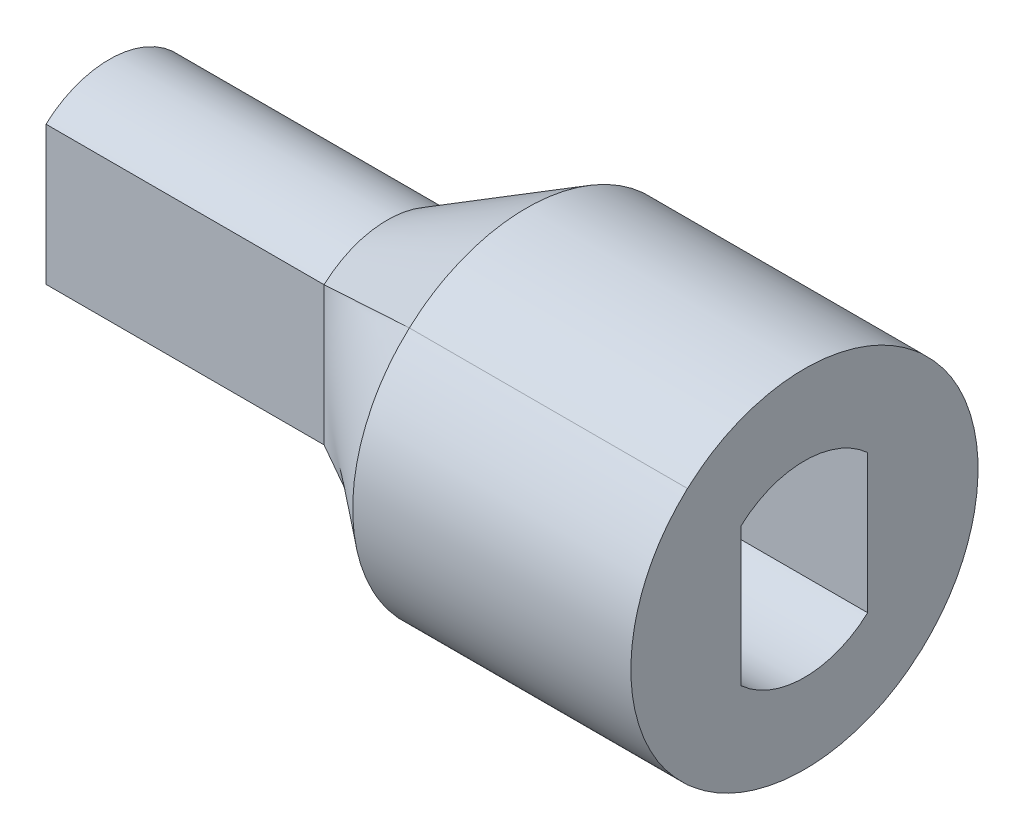
ISO-10303-21;
HEADER;
FILE_DESCRIPTION(('STEP AP214'),'2;1');
FILE_NAME('part.step','',(''),(''),'','','');
FILE_SCHEMA(('AUTOMOTIVE_DESIGN { 1 0 10303 214 1 1 1 1 }'));
ENDSEC;
DATA;
#1=APPLICATION_CONTEXT('core data for automotive mechanical design processes');
#2=APPLICATION_PROTOCOL_DEFINITION('international standard','automotive_design',2000,#1);
#3=PRODUCT_CONTEXT('',#1,'mechanical');
#4=PRODUCT('Part','Part','',(#3));
#5=PRODUCT_RELATED_PRODUCT_CATEGORY('part','',(#4));
#6=PRODUCT_DEFINITION_FORMATION('','',#4);
#7=PRODUCT_DEFINITION_CONTEXT('part definition',#1,'design');
#8=PRODUCT_DEFINITION('design','',#6,#7);
#9=PRODUCT_DEFINITION_SHAPE('','',#8);
#10=(LENGTH_UNIT() NAMED_UNIT(*) SI_UNIT(.MILLI.,.METRE.));
#11=(NAMED_UNIT(*) PLANE_ANGLE_UNIT() SI_UNIT($,.RADIAN.));
#12=(NAMED_UNIT(*) SI_UNIT($,.STERADIAN.) SOLID_ANGLE_UNIT());
#13=UNCERTAINTY_MEASURE_WITH_UNIT(LENGTH_MEASURE(1.E-05),#10,'distance_accuracy_value','');
#14=(GEOMETRIC_REPRESENTATION_CONTEXT(3) GLOBAL_UNCERTAINTY_ASSIGNED_CONTEXT((#13)) GLOBAL_UNIT_ASSIGNED_CONTEXT((#10,
#11,#12)) REPRESENTATION_CONTEXT('',''));
#15=CARTESIAN_POINT('',(0.,0.,0.));
#16=DIRECTION('',(0.,0.,1.));
#17=DIRECTION('',(1.,0.,0.));
#18=AXIS2_PLACEMENT_3D('',#15,#16,#17);
#19=CARTESIAN_POINT('',(8.,0.,-1.81870614886455));
#20=DIRECTION('',(0.,0.,1.));
#21=DIRECTION('',(1.,0.,0.));
#22=AXIS2_PLACEMENT_3D('',#19,#20,#21);
#23=PLANE('',#22);
#24=DIRECTION('',(0.,1.,0.));
#25=VECTOR('',#24,1.);
#26=CARTESIAN_POINT('',(0.,0.,-1.81870614886455));
#27=LINE('',#26,#25);
#28=CARTESIAN_POINT('',(0.,-1.99557208441145,-1.81870614886455));
#29=VERTEX_POINT('',#28);
#30=CARTESIAN_POINT('',(0.,1.99557208441145,-1.81870614886455));
#31=VERTEX_POINT('',#30);
#32=EDGE_CURVE('E446',#29,#31,#27,.T.);
#33=ORIENTED_EDGE('',*,*,#32,.T.);
#34=DIRECTION('',(-1.,0.,0.));
#35=VECTOR('',#34,1.);
#36=CARTESIAN_POINT('',(8.,1.99557208441145,-1.81870614886455));
#37=LINE('',#36,#35);
#38=CARTESIAN_POINT('',(8.,1.99557208441145,-1.81870614886455));
#39=VERTEX_POINT('',#38);
#40=EDGE_CURVE('E12',#39,#31,#37,.T.);
#41=ORIENTED_EDGE('',*,*,#40,.F.);
#42=DIRECTION('',(0.,1.,0.));
#43=VECTOR('',#42,1.);
#44=CARTESIAN_POINT('',(8.,0.,-1.81870614886455));
#45=LINE('',#44,#43);
#46=CARTESIAN_POINT('',(8.,-1.99557208441145,-1.81870614886455));
#47=VERTEX_POINT('',#46);
#48=EDGE_CURVE('E483',#47,#39,#45,.T.);
#49=ORIENTED_EDGE('',*,*,#48,.F.);
#50=DIRECTION('',(-1.,0.,0.));
#51=VECTOR('',#50,1.);
#52=CARTESIAN_POINT('',(8.,-1.99557208441145,-1.81870614886455));
#53=LINE('',#52,#51);
#54=EDGE_CURVE('E449',#47,#29,#53,.T.);
#55=ORIENTED_EDGE('',*,*,#54,.T.);
#56=EDGE_LOOP('',(#33,#41,#49,#55));
#57=FACE_BOUND('',#56,.T.);
#58=ADVANCED_FACE('F71',(#57),#23,.F.);
#59=CARTESIAN_POINT('',(8.,0.,0.));
#60=DIRECTION('',(-1.,0.,0.));
#61=DIRECTION('',(0.,0.,1.));
#62=AXIS2_PLACEMENT_3D('',#59,#60,#61);
#63=CYLINDRICAL_SURFACE('',#62,2.7);
#64=CARTESIAN_POINT('',(0.,0.,0.));
#65=DIRECTION('',(1.,0.,0.));
#66=DIRECTION('',(0.,0.,-1.));
#67=AXIS2_PLACEMENT_3D('',#64,#65,#66);
#68=CIRCLE('',#67,2.7);
#69=CARTESIAN_POINT('',(0.,1.99557208441145,1.81870614886455));
#70=VERTEX_POINT('',#69);
#71=EDGE_CURVE('E453',#31,#70,#68,.T.);
#72=ORIENTED_EDGE('',*,*,#71,.T.);
#73=DIRECTION('',(-1.,0.,0.));
#74=VECTOR('',#73,1.);
#75=CARTESIAN_POINT('',(8.,1.99557208441145,1.81870614886455));
#76=LINE('',#75,#74);
#77=CARTESIAN_POINT('',(8.,1.99557208441145,1.81870614886455));
#78=VERTEX_POINT('',#77);
#79=EDGE_CURVE('E81',#78,#70,#76,.T.);
#80=ORIENTED_EDGE('',*,*,#79,.F.);
#81=CARTESIAN_POINT('',(8.,0.,0.));
#82=DIRECTION('',(1.,0.,0.));
#83=DIRECTION('',(0.,0.,-1.));
#84=AXIS2_PLACEMENT_3D('',#81,#82,#83);
#85=CIRCLE('',#84,2.7);
#86=EDGE_CURVE('E486',#39,#78,#85,.T.);
#87=ORIENTED_EDGE('',*,*,#86,.F.);
#88=ORIENTED_EDGE('',*,*,#40,.T.);
#89=EDGE_LOOP('',(#72,#80,#87,#88));
#90=FACE_BOUND('',#89,.T.);
#91=ADVANCED_FACE('F432',(#90),#63,.T.);
#92=CARTESIAN_POINT('',(8.,0.,1.81870614886455));
#93=DIRECTION('',(0.,0.,1.));
#94=DIRECTION('',(1.,0.,0.));
#95=AXIS2_PLACEMENT_3D('',#92,#93,#94);
#96=PLANE('',#95);
#97=DIRECTION('',(0.,1.,0.));
#98=VECTOR('',#97,1.);
#99=CARTESIAN_POINT('',(0.,0.,1.81870614886455));
#100=LINE('',#99,#98);
#101=CARTESIAN_POINT('',(0.,-1.99557208441145,1.81870614886455));
#102=VERTEX_POINT('',#101);
#103=EDGE_CURVE('E459',#102,#70,#100,.T.);
#104=ORIENTED_EDGE('',*,*,#103,.F.);
#105=DIRECTION('',(-1.,0.,0.));
#106=VECTOR('',#105,1.);
#107=CARTESIAN_POINT('',(8.,-1.99557208441145,1.81870614886455));
#108=LINE('',#107,#106);
#109=CARTESIAN_POINT('',(8.,-1.99557208441145,1.81870614886455));
#110=VERTEX_POINT('',#109);
#111=EDGE_CURVE('E474',#110,#102,#108,.T.);
#112=ORIENTED_EDGE('',*,*,#111,.F.);
#113=DIRECTION('',(0.,1.,0.));
#114=VECTOR('',#113,1.);
#115=CARTESIAN_POINT('',(8.,0.,1.81870614886455));
#116=LINE('',#115,#114);
#117=EDGE_CURVE('E482',#110,#78,#116,.T.);
#118=ORIENTED_EDGE('',*,*,#117,.T.);
#119=ORIENTED_EDGE('',*,*,#79,.T.);
#120=EDGE_LOOP('',(#104,#112,#118,#119));
#121=FACE_BOUND('',#120,.T.);
#122=ADVANCED_FACE('F438',(#121),#96,.T.);
#123=EDGE_CURVE('E461',#102,#29,#68,.T.);
#124=ORIENTED_EDGE('',*,*,#123,.T.);
#125=ORIENTED_EDGE('',*,*,#54,.F.);
#126=CARTESIAN_POINT('',(8.,0.,0.));
#127=DIRECTION('',(1.,0.,0.));
#128=DIRECTION('',(0.,0.,-1.));
#129=AXIS2_PLACEMENT_3D('',#126,#127,#128);
#130=CIRCLE('',#129,2.7);
#131=EDGE_CURVE('E478',#110,#47,#130,.T.);
#132=ORIENTED_EDGE('',*,*,#131,.F.);
#133=ORIENTED_EDGE('',*,*,#111,.T.);
#134=EDGE_LOOP('',(#124,#125,#132,#133));
#135=FACE_BOUND('',#134,.T.);
#136=ADVANCED_FACE('F441',(#135),#63,.T.);
#137=CARTESIAN_POINT('',(0.,0.,0.));
#138=DIRECTION('',(1.,0.,0.));
#139=DIRECTION('',(0.,0.,-1.));
#140=AXIS2_PLACEMENT_3D('',#137,#138,#139);
#141=PLANE('',#140);
#142=ORIENTED_EDGE('',*,*,#32,.F.);
#143=ORIENTED_EDGE('',*,*,#123,.F.);
#144=ORIENTED_EDGE('',*,*,#103,.T.);
#145=ORIENTED_EDGE('',*,*,#71,.F.);
#146=EDGE_LOOP('',(#142,#143,#144,#145));
#147=FACE_BOUND('',#146,.T.);
#148=ADVANCED_FACE('F529',(#147),#141,.F.);
#149=CARTESIAN_POINT('',(8.,0.,0.));
#150=DIRECTION('',(1.,0.,0.));
#151=DIRECTION('',(0.,0.,-1.));
#152=AXIS2_PLACEMENT_3D('',#149,#150,#151);
#153=CONICAL_SURFACE('',#152,2.7,0.521176118415313);
#154=DIRECTION('',(0.86723418972472,0.367998608506939,0.33538319026073));
#155=VECTOR('',#154,1.);
#156=CARTESIAN_POINT('',(8.,1.99557208441145,1.81870614886455));
#157=LINE('',#156,#155);
#158=CARTESIAN_POINT('',(12.,3.69291572176851,3.36561559609098));
#159=VERTEX_POINT('',#158);
#160=EDGE_CURVE('E97',#78,#159,#157,.T.);
#161=ORIENTED_EDGE('',*,*,#160,.T.);
#162=CARTESIAN_POINT('',(12.,0.,0.));
#163=DIRECTION('',(1.,0.,0.));
#164=DIRECTION('',(0.,0.,-1.));
#165=AXIS2_PLACEMENT_3D('',#162,#163,#164);
#166=CIRCLE('',#165,4.99649826065574);
#167=CARTESIAN_POINT('',(12.,3.69291572176851,-3.36561559609098));
#168=VERTEX_POINT('',#167);
#169=EDGE_CURVE('E261',#168,#159,#166,.T.);
#170=ORIENTED_EDGE('',*,*,#169,.F.);
#171=DIRECTION('',(0.86723418972472,0.367998608506939,-0.33538319026073));
#172=VECTOR('',#171,1.);
#173=CARTESIAN_POINT('',(8.,1.99557208441145,-1.81870614886455));
#174=LINE('',#173,#172);
#175=EDGE_CURVE('E276',#39,#168,#174,.T.);
#176=ORIENTED_EDGE('',*,*,#175,.F.);
#177=ORIENTED_EDGE('',*,*,#86,.T.);
#178=EDGE_LOOP('',(#161,#170,#176,#177));
#179=FACE_BOUND('',#178,.T.);
#180=ADVANCED_FACE('F236',(#179),#153,.T.);
#181=CARTESIAN_POINT('',(8.,-1.99557208441145,-1.81870614886455));
#182=CARTESIAN_POINT('',(12.,-3.69291572176851,-3.36561559609098));
#183=CARTESIAN_POINT('',(8.,-1.8292744107105,-1.81870614886455));
#184=CARTESIAN_POINT('',(12.,-3.48562163132348,-3.59306866783312));
#185=CARTESIAN_POINT('',(8.,-1.66297673700954,-1.81870614886455));
#186=CARTESIAN_POINT('',(12.,-3.24853151808313,-3.81075682692467));
#187=CARTESIAN_POINT('',(8.,-1.33038138960764,-1.81870614886455));
#188=CARTESIAN_POINT('',(12.,-2.71677138618844,-4.2064210266116));
#189=CARTESIAN_POINT('',(8.,-1.16408371590668,-1.81870614886455));
#190=CARTESIAN_POINT('',(12.,-2.42204965704319,-4.38424865942471));
#191=CARTESIAN_POINT('',(8.,-0.831488368504773,-1.81870614886455));
#192=CARTESIAN_POINT('',(12.,-1.7859309912595,-4.67957384206182));
#193=CARTESIAN_POINT('',(8.,-0.665190694803818,-1.81870614886455));
#194=CARTESIAN_POINT('',(12.,-1.44458471323877,-4.79689289330503));
#195=CARTESIAN_POINT('',(8.,-0.33259534740191,-1.81870614886455));
#196=CARTESIAN_POINT('',(12.,-0.735418950472063,-4.95541778166584));
#197=CARTESIAN_POINT('',(8.,-0.166297673700956,-1.81870614886455));
#198=CARTESIAN_POINT('',(12.,-0.367762810868639,-4.99649826065574));
#199=CARTESIAN_POINT('',(8.,0.166297673700953,-1.81870614886455));
#200=CARTESIAN_POINT('',(12.,0.367762810868638,-4.99649826065574));
#201=CARTESIAN_POINT('',(8.,0.332595347401908,-1.81870614886455));
#202=CARTESIAN_POINT('',(12.,0.735418950472063,-4.95541778166584));
#203=CARTESIAN_POINT('',(8.,0.665190694803817,-1.81870614886455));
#204=CARTESIAN_POINT('',(12.,1.44458471323877,-4.79689289330503));
#205=CARTESIAN_POINT('',(8.,0.831488368504771,-1.81870614886455));
#206=CARTESIAN_POINT('',(12.,1.7859309912595,-4.67957384206182));
#207=CARTESIAN_POINT('',(8.,1.16408371590668,-1.81870614886455));
#208=CARTESIAN_POINT('',(12.,2.42204965704319,-4.38424865942471));
#209=CARTESIAN_POINT('',(8.,1.33038138960763,-1.81870614886455));
#210=CARTESIAN_POINT('',(12.,2.71677138618844,-4.20642102661161));
#211=CARTESIAN_POINT('',(8.,1.66297673700954,-1.81870614886455));
#212=CARTESIAN_POINT('',(12.,3.24853151808313,-3.81075682692468));
#213=CARTESIAN_POINT('',(8.,1.8292744107105,-1.81870614886455));
#214=CARTESIAN_POINT('',(12.,3.48562163132348,-3.59306866783312));
#215=CARTESIAN_POINT('',(8.,1.99557208441145,-1.81870614886455));
#216=CARTESIAN_POINT('',(12.,3.69291572176851,-3.36561559609098));
#217=B_SPLINE_SURFACE_WITH_KNOTS('',3,1,((#181,#182),(#183,#184),(#185,#186),(#187,#188),(#189,
#190),(#191,#192),(#193,#194),(#195,#196),(#197,#198),(#199,#200),(#201,#202),(#203,#204),(#205,
#206),(#207,#208),(#209,#210),(#211,#212),(#213,#214),(#215,#216)),.UNSPECIFIED.,.F.,.F.,.F.,(4,
2,2,2,2,2,2,2,4),(2,2),(0.,0.125,0.25,0.375,0.5,0.625,0.75,0.875,1.),(0.,1.),.UNSPECIFIED.);
#218=CARTESIAN_POINT('',(12.,-3.69291572176851,-3.36561559609097));
#219=VERTEX_POINT('',#218);
#220=EDGE_CURVE('E74',#219,#168,#166,.T.);
#221=DIRECTION('',(0.86723418972472,-0.367998608506939,-0.33538319026073));
#222=VECTOR('',#221,1.);
#223=CARTESIAN_POINT('',(8.,-1.99557208441145,-1.81870614886455));
#224=LINE('',#223,#222);
#225=EDGE_CURVE('E454',#47,#219,#224,.T.);
#226=ORIENTED_EDGE('',*,*,#48,.T.);
#227=ORIENTED_EDGE('',*,*,#175,.T.);
#228=ORIENTED_EDGE('',*,*,#220,.F.);
#229=ORIENTED_EDGE('',*,*,#225,.F.);
#230=EDGE_LOOP('',(#226,#227,#228,#229));
#231=FACE_BOUND('',#230,.T.);
#232=ADVANCED_FACE('F550',(#231),#217,.T.);
#233=CARTESIAN_POINT('',(8.,1.99557208441145,1.81870614886455));
#234=CARTESIAN_POINT('',(12.,3.69291572176851,3.36561559609098));
#235=CARTESIAN_POINT('',(8.,1.8292744107105,1.81870614886455));
#236=CARTESIAN_POINT('',(12.,3.48562163132348,3.59306866783312));
#237=CARTESIAN_POINT('',(8.,1.66297673700954,1.81870614886455));
#238=CARTESIAN_POINT('',(12.,3.24853151808313,3.81075682692468));
#239=CARTESIAN_POINT('',(8.,1.33038138960764,1.81870614886455));
#240=CARTESIAN_POINT('',(12.,2.71677138618844,4.2064210266116));
#241=CARTESIAN_POINT('',(8.,1.16408371590668,1.81870614886455));
#242=CARTESIAN_POINT('',(12.,2.42204965704319,4.38424865942471));
#243=CARTESIAN_POINT('',(8.,0.831488368504773,1.81870614886455));
#244=CARTESIAN_POINT('',(12.,1.7859309912595,4.67957384206182));
#245=CARTESIAN_POINT('',(8.,0.665190694803819,1.81870614886455));
#246=CARTESIAN_POINT('',(12.,1.44458471323877,4.79689289330503));
#247=CARTESIAN_POINT('',(8.,0.33259534740191,1.81870614886455));
#248=CARTESIAN_POINT('',(12.,0.735418950472064,4.95541778166584));
#249=CARTESIAN_POINT('',(8.,0.166297673700956,1.81870614886455));
#250=CARTESIAN_POINT('',(12.,0.367762810868639,4.99649826065574));
#251=CARTESIAN_POINT('',(8.,-0.166297673700953,1.81870614886455));
#252=CARTESIAN_POINT('',(12.,-0.367762810868637,4.99649826065574));
#253=CARTESIAN_POINT('',(8.,-0.332595347401907,1.81870614886455));
#254=CARTESIAN_POINT('',(12.,-0.735418950472062,4.95541778166584));
#255=CARTESIAN_POINT('',(8.,-0.665190694803816,1.81870614886455));
#256=CARTESIAN_POINT('',(12.,-1.44458471323877,4.79689289330503));
#257=CARTESIAN_POINT('',(8.,-0.831488368504771,1.81870614886455));
#258=CARTESIAN_POINT('',(12.,-1.7859309912595,4.67957384206182));
#259=CARTESIAN_POINT('',(8.,-1.16408371590668,1.81870614886455));
#260=CARTESIAN_POINT('',(12.,-2.42204965704319,4.38424865942471));
#261=CARTESIAN_POINT('',(8.,-1.33038138960763,1.81870614886455));
#262=CARTESIAN_POINT('',(12.,-2.71677138618844,4.20642102661161));
#263=CARTESIAN_POINT('',(8.,-1.66297673700954,1.81870614886455));
#264=CARTESIAN_POINT('',(12.,-3.24853151808313,3.81075682692468));
#265=CARTESIAN_POINT('',(8.,-1.8292744107105,1.81870614886455));
#266=CARTESIAN_POINT('',(12.,-3.48562163132348,3.59306866783312));
#267=CARTESIAN_POINT('',(8.,-1.99557208441145,1.81870614886455));
#268=CARTESIAN_POINT('',(12.,-3.69291572176851,3.36561559609098));
#269=B_SPLINE_SURFACE_WITH_KNOTS('',3,1,((#233,#234),(#235,#236),(#237,#238),(#239,#240),(#241,
#242),(#243,#244),(#245,#246),(#247,#248),(#249,#250),(#251,#252),(#253,#254),(#255,#256),(#257,
#258),(#259,#260),(#261,#262),(#263,#264),(#265,#266),(#267,#268)),.UNSPECIFIED.,.F.,.F.,.F.,(4,
2,2,2,2,2,2,2,4),(2,2),(0.,0.125,0.25,0.375,0.5,0.625,0.75,0.875,1.),(0.,1.),.UNSPECIFIED.);
#270=DIRECTION('',(0.86723418972472,-0.367998608506938,0.335383190260731));
#271=VECTOR('',#270,1.);
#272=CARTESIAN_POINT('',(10.,-2.84424390308998,2.59216087247777));
#273=LINE('',#272,#271);
#274=CARTESIAN_POINT('',(12.,-3.69291572176851,3.36561559609098));
#275=VERTEX_POINT('',#274);
#276=EDGE_CURVE('E256',#110,#275,#273,.T.);
#277=EDGE_CURVE('E264',#159,#275,#166,.T.);
#278=ORIENTED_EDGE('',*,*,#117,.F.);
#279=ORIENTED_EDGE('',*,*,#276,.T.);
#280=ORIENTED_EDGE('',*,*,#277,.F.);
#281=ORIENTED_EDGE('',*,*,#160,.F.);
#282=EDGE_LOOP('',(#278,#279,#280,#281));
#283=FACE_BOUND('',#282,.T.);
#284=ADVANCED_FACE('F497',(#283),#269,.T.);
#285=CARTESIAN_POINT('',(8.,0.,0.));
#286=DIRECTION('',(1.,0.,0.));
#287=DIRECTION('',(0.,0.,-1.));
#288=AXIS2_PLACEMENT_3D('',#285,#286,#287);
#289=CONICAL_SURFACE('',#288,2.7,0.521176118415313);
#290=ORIENTED_EDGE('',*,*,#225,.T.);
#291=EDGE_CURVE('E266',#275,#219,#166,.T.);
#292=ORIENTED_EDGE('',*,*,#291,.F.);
#293=ORIENTED_EDGE('',*,*,#276,.F.);
#294=ORIENTED_EDGE('',*,*,#131,.T.);
#295=EDGE_LOOP('',(#290,#292,#293,#294));
#296=FACE_BOUND('',#295,.T.);
#297=ADVANCED_FACE('F232',(#296),#289,.T.);
#298=CARTESIAN_POINT('',(20.,3.69291572176851,3.36561559609098));
#299=CARTESIAN_POINT('',(20.,3.5729146397091,3.49069687233272));
#300=CARTESIAN_POINT('',(20.,3.3284088282014,3.73620465926743));
#301=CARTESIAN_POINT('',(20.,2.92527797189008,4.06356608337924));
#302=CARTESIAN_POINT('',(20.,2.48841073758551,4.34450729753157));
#303=CARTESIAN_POINT('',(20.,1.86901592415575,4.65561273686763));
#304=CARTESIAN_POINT('',(20.,1.03942388692487,4.9214586641175));
#305=CARTESIAN_POINT('',(20.,0.173244932208205,5.01224150102338));
#306=CARTESIAN_POINT('',(20.,-0.519716016392923,4.97623765002099));
#307=CARTESIAN_POINT('',(20.,-1.03400007893868,4.8956556220121));
#308=CARTESIAN_POINT('',(20.,-1.62120597598052,4.74033323006369));
#309=CARTESIAN_POINT('',(20.,-2.10373134300273,4.54338367213307));
#310=CARTESIAN_POINT('',(20.,-2.56107621326455,4.29773565047842));
#311=CARTESIAN_POINT('',(20.,-2.92470388796895,4.06310134007066));
#312=CARTESIAN_POINT('',(20.,-3.32680871798416,3.73476861874533));
#313=CARTESIAN_POINT('',(20.,-3.57218692271475,3.49004450756609));
#314=CARTESIAN_POINT('',(20.,-3.69291572176851,3.36561559609098));
#315=B_SPLINE_CURVE_WITH_KNOTS('',3,(#298,#299,#300,#301,#302,#303,#304,#305,#306,#307,#308,
#309,#310,#311,#312,#313,#314),.UNSPECIFIED.,.F.,.F.,(4,1,1,1,1,1,1,1,1,1,1,1,1,1,4),(0.,0.0625,
0.125,0.1875,0.25,0.375,0.5,0.5625,0.625,0.6875,0.78125,0.8125,0.875,0.9375,1.),.UNSPECIFIED.);
#316=DIRECTION('',(-1.,0.,0.));
#317=VECTOR('',#316,1.);
#318=SURFACE_OF_LINEAR_EXTRUSION('',#315,#317);
#319=ORIENTED_EDGE('',*,*,#277,.T.);
#320=DIRECTION('',(-1.,0.,0.));
#321=VECTOR('',#320,1.);
#322=CARTESIAN_POINT('',(20.,-3.69291572176851,3.36561559609098));
#323=LINE('',#322,#321);
#324=CARTESIAN_POINT('',(20.,-3.69291572176851,3.36561559609098));
#325=VERTEX_POINT('',#324);
#326=EDGE_CURVE('E292',#325,#275,#323,.T.);
#327=ORIENTED_EDGE('',*,*,#326,.F.);
#328=CARTESIAN_POINT('',(20.,-3.69291572176851,3.36561559609098));
#329=CARTESIAN_POINT('',(20.,-3.57218692271475,3.49004450756609));
#330=CARTESIAN_POINT('',(20.,-3.32680871798416,3.73476861874533));
#331=CARTESIAN_POINT('',(20.,-2.92470388796895,4.06310134007066));
#332=CARTESIAN_POINT('',(20.,-2.56107621326455,4.29773565047842));
#333=CARTESIAN_POINT('',(20.,-2.10373134300273,4.54338367213307));
#334=CARTESIAN_POINT('',(20.,-1.62120597598052,4.74033323006369));
#335=CARTESIAN_POINT('',(20.,-1.03400007893868,4.8956556220121));
#336=CARTESIAN_POINT('',(20.,-0.519716016392923,4.97623765002099));
#337=CARTESIAN_POINT('',(20.,0.173244932208205,5.01224150102338));
#338=CARTESIAN_POINT('',(20.,1.03942388692487,4.9214586641175));
#339=CARTESIAN_POINT('',(20.,1.86901592415575,4.65561273686763));
#340=CARTESIAN_POINT('',(20.,2.48841073758551,4.34450729753157));
#341=CARTESIAN_POINT('',(20.,2.92527797189008,4.06356608337924));
#342=CARTESIAN_POINT('',(20.,3.3284088282014,3.73620465926743));
#343=CARTESIAN_POINT('',(20.,3.5729146397091,3.49069687233272));
#344=CARTESIAN_POINT('',(20.,3.69291572176851,3.36561559609098));
#345=B_SPLINE_CURVE_WITH_KNOTS('',3,(#328,#329,#330,#331,#332,#333,#334,#335,#336,#337,#338,
#339,#340,#341,#342,#343,#344),.UNSPECIFIED.,.F.,.F.,(4,1,1,1,1,1,1,1,1,1,1,1,1,1,4),(0.,0.0625,
0.125,0.1875,0.21875,0.3125,0.375,0.4375,0.5,0.625,0.75,0.8125,0.875,0.9375,1.),.UNSPECIFIED.);
#346=CARTESIAN_POINT('',(20.,3.69291572176851,3.36561559609098));
#347=VERTEX_POINT('',#346);
#348=EDGE_CURVE('E208',#347,#325,#345,.F.);
#349=ORIENTED_EDGE('',*,*,#348,.F.);
#350=DIRECTION('',(-1.,0.,0.));
#351=VECTOR('',#350,1.);
#352=CARTESIAN_POINT('',(20.,3.69291572176851,3.36561559609098));
#353=LINE('',#352,#351);
#354=EDGE_CURVE('E368',#347,#159,#353,.T.);
#355=ORIENTED_EDGE('',*,*,#354,.T.);
#356=EDGE_LOOP('',(#319,#327,#349,#355));
#357=FACE_BOUND('',#356,.T.);
#358=ADVANCED_FACE('F226',(#357),#318,.F.);
#359=CARTESIAN_POINT('',(20.,-3.69291572176851,3.36561559609098));
#360=CARTESIAN_POINT('',(20.,-3.74261446355927,3.30678744791323));
#361=CARTESIAN_POINT('',(20.,-3.84152511231977,3.18876956217872));
#362=CARTESIAN_POINT('',(20.,-3.98552462795836,3.00849967661833));
#363=CARTESIAN_POINT('',(20.,-4.12129666230725,2.82219052710088));
#364=CARTESIAN_POINT('',(20.,-4.28987500798542,2.56524262974254));
#365=CARTESIAN_POINT('',(20.,-4.47690569004402,2.22928005913653));
#366=CARTESIAN_POINT('',(20.,-4.72479212702742,1.6658543860079));
#367=CARTESIAN_POINT('',(20.,-4.89362583616925,1.07145682015042));
#368=CARTESIAN_POINT('',(20.,-4.97898507378638,0.46146655762521));
#369=CARTESIAN_POINT('',(20.,-5.00022984332631,3.51688715016946E-05));
#370=CARTESIAN_POINT('',(20.,-4.9785128666441,-0.461458465553685));
#371=CARTESIAN_POINT('',(20.,-4.89326880952822,-1.07169260248251));
#372=CARTESIAN_POINT('',(20.,-4.74633504938937,-1.59218560666538));
#373=CARTESIAN_POINT('',(20.,-4.57101440547539,-2.0190220902083));
#374=CARTESIAN_POINT('',(20.,-4.47358780915316,-2.22809048121051));
#375=CARTESIAN_POINT('',(20.,-4.36644450717256,-2.43226918097572));
#376=CARTESIAN_POINT('',(20.,-4.21065113539044,-2.69722942147279));
#377=CARTESIAN_POINT('',(20.,-3.99120071248005,-3.01290707553457));
#378=CARTESIAN_POINT('',(20.,-3.79286689355638,-3.24844706741331));
#379=CARTESIAN_POINT('',(20.,-3.69291572176851,-3.36561559609097));
#380=B_SPLINE_CURVE_WITH_KNOTS('',3,(#359,#360,#361,#362,#363,#364,#365,#366,#367,#368,#369,
#370,#371,#372,#373,#374,#375,#376,#377,#378,#379),.UNSPECIFIED.,.F.,.F.,(4,1,1,1,1,1,1,1,1,1,1,
1,1,1,1,1,1,1,4),(0.,0.03125,0.0625,0.09375,0.125,0.1875,0.25,0.375,0.4375,0.5,0.5625,0.625,
0.75,0.78125,0.8125,0.84375,0.875,0.9375,1.),.UNSPECIFIED.);
#381=DIRECTION('',(-1.,0.,0.));
#382=VECTOR('',#381,1.);
#383=SURFACE_OF_LINEAR_EXTRUSION('',#380,#382);
#384=ORIENTED_EDGE('',*,*,#291,.T.);
#385=DIRECTION('',(-1.,0.,0.));
#386=VECTOR('',#385,1.);
#387=CARTESIAN_POINT('',(20.,-3.69291572176851,-3.36561559609097));
#388=LINE('',#387,#386);
#389=CARTESIAN_POINT('',(20.,-3.69291572176851,-3.36561559609097));
#390=VERTEX_POINT('',#389);
#391=EDGE_CURVE('E295',#390,#219,#388,.T.);
#392=ORIENTED_EDGE('',*,*,#391,.F.);
#393=CARTESIAN_POINT('',(20.,-3.69291572176851,-3.36561559609097));
#394=CARTESIAN_POINT('',(20.,-3.79286689355638,-3.24844706741331));
#395=CARTESIAN_POINT('',(20.,-3.99120071248005,-3.01290707553457));
#396=CARTESIAN_POINT('',(20.,-4.21065113539044,-2.69722942147279));
#397=CARTESIAN_POINT('',(20.,-4.36644450717256,-2.43226918097572));
#398=CARTESIAN_POINT('',(20.,-4.47358780915316,-2.22809048121051));
#399=CARTESIAN_POINT('',(20.,-4.57101440547539,-2.0190220902083));
#400=CARTESIAN_POINT('',(20.,-4.74633504938937,-1.59218560666538));
#401=CARTESIAN_POINT('',(20.,-4.89326880952822,-1.07169260248251));
#402=CARTESIAN_POINT('',(20.,-4.9785128666441,-0.461458465553685));
#403=CARTESIAN_POINT('',(20.,-5.00022984332631,3.51688715016946E-05));
#404=CARTESIAN_POINT('',(20.,-4.97898507378638,0.46146655762521));
#405=CARTESIAN_POINT('',(20.,-4.89362583616925,1.07145682015042));
#406=CARTESIAN_POINT('',(20.,-4.72479212702742,1.6658543860079));
#407=CARTESIAN_POINT('',(20.,-4.47690569004402,2.22928005913653));
#408=CARTESIAN_POINT('',(20.,-4.28987500798542,2.56524262974254));
#409=CARTESIAN_POINT('',(20.,-4.12129666230725,2.82219052710088));
#410=CARTESIAN_POINT('',(20.,-3.98552462795836,3.00849967661833));
#411=CARTESIAN_POINT('',(20.,-3.84152511231977,3.18876956217872));
#412=CARTESIAN_POINT('',(20.,-3.74261446355927,3.30678744791323));
#413=CARTESIAN_POINT('',(20.,-3.69291572176851,3.36561559609098));
#414=B_SPLINE_CURVE_WITH_KNOTS('',3,(#393,#394,#395,#396,#397,#398,#399,#400,#401,#402,#403,
#404,#405,#406,#407,#408,#409,#410,#411,#412,#413),.UNSPECIFIED.,.F.,.F.,(4,1,1,1,1,1,1,1,1,1,1,
1,1,1,1,1,1,1,4),(0.,0.0625,0.125,0.15625,0.1875,0.21875,0.25,0.375,0.4375,0.5,0.5625,0.625,
0.75,0.8125,0.875,0.90625,0.9375,0.96875,1.),.UNSPECIFIED.);
#415=EDGE_CURVE('E360',#325,#390,#414,.F.);
#416=ORIENTED_EDGE('',*,*,#415,.F.);
#417=ORIENTED_EDGE('',*,*,#326,.T.);
#418=EDGE_LOOP('',(#384,#392,#416,#417));
#419=FACE_BOUND('',#418,.T.);
#420=ADVANCED_FACE('F231',(#419),#383,.F.);
#421=CARTESIAN_POINT('',(20.,-3.69291572176851,-3.36561559609097));
#422=CARTESIAN_POINT('',(20.,-3.5729146397091,-3.49069687233272));
#423=CARTESIAN_POINT('',(20.,-3.3284088282014,-3.73620465926743));
#424=CARTESIAN_POINT('',(20.,-2.92527797189008,-4.06356608337924));
#425=CARTESIAN_POINT('',(20.,-2.48841073758551,-4.34450729753157));
#426=CARTESIAN_POINT('',(20.,-1.86901592415575,-4.65561273686763));
#427=CARTESIAN_POINT('',(20.,-1.03942388692487,-4.9214586641175));
#428=CARTESIAN_POINT('',(20.,-0.173244932208205,-5.01224150102338));
#429=CARTESIAN_POINT('',(20.,0.519716016392925,-4.97623765002099));
#430=CARTESIAN_POINT('',(20.,1.03400007893869,-4.8956556220121));
#431=CARTESIAN_POINT('',(20.,1.62120597598052,-4.7403332300637));
#432=CARTESIAN_POINT('',(20.,2.10373134300274,-4.54338367213308));
#433=CARTESIAN_POINT('',(20.,2.56107621326456,-4.29773565047842));
#434=CARTESIAN_POINT('',(20.,2.92470388796895,-4.06310134007066));
#435=CARTESIAN_POINT('',(20.,3.32680871798416,-3.73476861874533));
#436=CARTESIAN_POINT('',(20.,3.57218692271475,-3.49004450756609));
#437=CARTESIAN_POINT('',(20.,3.69291572176851,-3.36561559609098));
#438=B_SPLINE_CURVE_WITH_KNOTS('',3,(#421,#422,#423,#424,#425,#426,#427,#428,#429,#430,#431,
#432,#433,#434,#435,#436,#437),.UNSPECIFIED.,.F.,.F.,(4,1,1,1,1,1,1,1,1,1,1,1,1,1,4),(0.,0.0625,
0.125,0.1875,0.25,0.375,0.5,0.5625,0.625,0.6875,0.78125,0.8125,0.875,0.9375,1.),.UNSPECIFIED.);
#439=DIRECTION('',(-1.,0.,0.));
#440=VECTOR('',#439,1.);
#441=SURFACE_OF_LINEAR_EXTRUSION('',#438,#440);
#442=ORIENTED_EDGE('',*,*,#220,.T.);
#443=DIRECTION('',(-1.,0.,0.));
#444=VECTOR('',#443,1.);
#445=CARTESIAN_POINT('',(20.,3.69291572176851,-3.36561559609098));
#446=LINE('',#445,#444);
#447=CARTESIAN_POINT('',(20.,3.69291572176851,-3.36561559609098));
#448=VERTEX_POINT('',#447);
#449=EDGE_CURVE('E298',#448,#168,#446,.T.);
#450=ORIENTED_EDGE('',*,*,#449,.F.);
#451=CARTESIAN_POINT('',(20.,3.69291572176851,-3.36561559609098));
#452=CARTESIAN_POINT('',(20.,3.57218692271475,-3.49004450756609));
#453=CARTESIAN_POINT('',(20.,3.32680871798416,-3.73476861874533));
#454=CARTESIAN_POINT('',(20.,2.92470388796895,-4.06310134007066));
#455=CARTESIAN_POINT('',(20.,2.56107621326456,-4.29773565047842));
#456=CARTESIAN_POINT('',(20.,2.10373134300274,-4.54338367213308));
#457=CARTESIAN_POINT('',(20.,1.62120597598052,-4.7403332300637));
#458=CARTESIAN_POINT('',(20.,1.03400007893869,-4.8956556220121));
#459=CARTESIAN_POINT('',(20.,0.519716016392925,-4.97623765002099));
#460=CARTESIAN_POINT('',(20.,-0.173244932208205,-5.01224150102338));
#461=CARTESIAN_POINT('',(20.,-1.03942388692487,-4.9214586641175));
#462=CARTESIAN_POINT('',(20.,-1.86901592415575,-4.65561273686763));
#463=CARTESIAN_POINT('',(20.,-2.48841073758551,-4.34450729753157));
#464=CARTESIAN_POINT('',(20.,-2.92527797189008,-4.06356608337924));
#465=CARTESIAN_POINT('',(20.,-3.3284088282014,-3.73620465926743));
#466=CARTESIAN_POINT('',(20.,-3.5729146397091,-3.49069687233272));
#467=CARTESIAN_POINT('',(20.,-3.69291572176851,-3.36561559609097));
#468=B_SPLINE_CURVE_WITH_KNOTS('',3,(#451,#452,#453,#454,#455,#456,#457,#458,#459,#460,#461,
#462,#463,#464,#465,#466,#467),.UNSPECIFIED.,.F.,.F.,(4,1,1,1,1,1,1,1,1,1,1,1,1,1,4),(0.,0.0625,
0.125,0.1875,0.21875,0.3125,0.375,0.4375,0.5,0.625,0.75,0.8125,0.875,0.9375,1.),.UNSPECIFIED.);
#469=EDGE_CURVE('E363',#390,#448,#468,.F.);
#470=ORIENTED_EDGE('',*,*,#469,.F.);
#471=ORIENTED_EDGE('',*,*,#391,.T.);
#472=EDGE_LOOP('',(#442,#450,#470,#471));
#473=FACE_BOUND('',#472,.T.);
#474=ADVANCED_FACE('F394',(#473),#441,.F.);
#475=CARTESIAN_POINT('',(20.,3.69291572176851,-3.36561559609098));
#476=CARTESIAN_POINT('',(20.,3.74261446355927,-3.30678744791323));
#477=CARTESIAN_POINT('',(20.,3.84152511231977,-3.18876956217872));
#478=CARTESIAN_POINT('',(20.,3.98552462795836,-3.00849967661832));
#479=CARTESIAN_POINT('',(20.,4.12129666230725,-2.82219052710088));
#480=CARTESIAN_POINT('',(20.,4.28987500798542,-2.56524262974253));
#481=CARTESIAN_POINT('',(20.,4.47690569004402,-2.22928005913652));
#482=CARTESIAN_POINT('',(20.,4.72479212702742,-1.6658543860079));
#483=CARTESIAN_POINT('',(20.,4.89362583616925,-1.07145682015042));
#484=CARTESIAN_POINT('',(20.,4.97898507378638,-0.461466557625213));
#485=CARTESIAN_POINT('',(20.,5.00022984332631,-3.51688715089072E-05));
#486=CARTESIAN_POINT('',(20.,4.9785128666441,0.461458465553671));
#487=CARTESIAN_POINT('',(20.,4.89326880952822,1.07169260248249));
#488=CARTESIAN_POINT('',(20.,4.74633504938937,1.59218560666535));
#489=CARTESIAN_POINT('',(20.,4.57101440547539,2.01902209020828));
#490=CARTESIAN_POINT('',(20.,4.47358780915316,2.22809048121049));
#491=CARTESIAN_POINT('',(20.,4.36644450717256,2.43226918097571));
#492=CARTESIAN_POINT('',(20.,4.21065113539044,2.69722942147278));
#493=CARTESIAN_POINT('',(20.,3.99120071248005,3.01290707553457));
#494=CARTESIAN_POINT('',(20.,3.79286689355637,3.24844706741332));
#495=CARTESIAN_POINT('',(20.,3.69291572176851,3.36561559609098));
#496=B_SPLINE_CURVE_WITH_KNOTS('',3,(#475,#476,#477,#478,#479,#480,#481,#482,#483,#484,#485,
#486,#487,#488,#489,#490,#491,#492,#493,#494,#495),.UNSPECIFIED.,.F.,.F.,(4,1,1,1,1,1,1,1,1,1,1,
1,1,1,1,1,1,1,4),(0.,0.03125,0.0625,0.09375,0.125,0.1875,0.25,0.375,0.4375,0.5,0.5625,0.625,
0.75,0.78125,0.8125,0.84375,0.875,0.9375,1.),.UNSPECIFIED.);
#497=DIRECTION('',(-1.,0.,0.));
#498=VECTOR('',#497,1.);
#499=SURFACE_OF_LINEAR_EXTRUSION('',#496,#498);
#500=ORIENTED_EDGE('',*,*,#169,.T.);
#501=ORIENTED_EDGE('',*,*,#354,.F.);
#502=CARTESIAN_POINT('',(20.,3.69291572176851,3.36561559609098));
#503=CARTESIAN_POINT('',(20.,3.79286689355637,3.24844706741332));
#504=CARTESIAN_POINT('',(20.,3.99120071248005,3.01290707553457));
#505=CARTESIAN_POINT('',(20.,4.21065113539044,2.69722942147278));
#506=CARTESIAN_POINT('',(20.,4.36644450717256,2.43226918097571));
#507=CARTESIAN_POINT('',(20.,4.47358780915316,2.22809048121049));
#508=CARTESIAN_POINT('',(20.,4.57101440547539,2.01902209020828));
#509=CARTESIAN_POINT('',(20.,4.74633504938937,1.59218560666535));
#510=CARTESIAN_POINT('',(20.,4.89326880952822,1.07169260248249));
#511=CARTESIAN_POINT('',(20.,4.9785128666441,0.461458465553671));
#512=CARTESIAN_POINT('',(20.,5.00022984332631,-3.51688715089072E-05));
#513=CARTESIAN_POINT('',(20.,4.97898507378638,-0.461466557625213));
#514=CARTESIAN_POINT('',(20.,4.89362583616925,-1.07145682015042));
#515=CARTESIAN_POINT('',(20.,4.72479212702742,-1.6658543860079));
#516=CARTESIAN_POINT('',(20.,4.47690569004402,-2.22928005913652));
#517=CARTESIAN_POINT('',(20.,4.28987500798542,-2.56524262974253));
#518=CARTESIAN_POINT('',(20.,4.12129666230725,-2.82219052710088));
#519=CARTESIAN_POINT('',(20.,3.98552462795836,-3.00849967661832));
#520=CARTESIAN_POINT('',(20.,3.84152511231977,-3.18876956217872));
#521=CARTESIAN_POINT('',(20.,3.74261446355927,-3.30678744791323));
#522=CARTESIAN_POINT('',(20.,3.69291572176851,-3.36561559609098));
#523=B_SPLINE_CURVE_WITH_KNOTS('',3,(#502,#503,#504,#505,#506,#507,#508,#509,#510,#511,#512,
#513,#514,#515,#516,#517,#518,#519,#520,#521,#522),.UNSPECIFIED.,.F.,.F.,(4,1,1,1,1,1,1,1,1,1,1,
1,1,1,1,1,1,1,4),(0.,0.0625,0.125,0.15625,0.1875,0.21875,0.25,0.375,0.4375,0.5,0.5625,0.625,
0.75,0.8125,0.875,0.90625,0.9375,0.96875,1.),.UNSPECIFIED.);
#524=EDGE_CURVE('E366',#448,#347,#523,.F.);
#525=ORIENTED_EDGE('',*,*,#524,.F.);
#526=ORIENTED_EDGE('',*,*,#449,.T.);
#527=EDGE_LOOP('',(#500,#501,#525,#526));
#528=FACE_BOUND('',#527,.T.);
#529=ADVANCED_FACE('F332',(#528),#499,.F.);
#530=CARTESIAN_POINT('',(20.,3.21298894002226E-06,4.99418802822886));
#531=DIRECTION('',(1.,0.,0.));
#532=DIRECTION('',(0.,0.,-1.));
#533=AXIS2_PLACEMENT_3D('',#530,#531,#532);
#534=PLANE('',#533);
#535=CARTESIAN_POINT('',(20.,0.,0.));
#536=DIRECTION('',(1.,0.,0.));
#537=DIRECTION('',(0.,0.,-1.));
#538=AXIS2_PLACEMENT_3D('',#535,#536,#537);
#539=CIRCLE('',#538,2.7);
#540=CARTESIAN_POINT('',(20.,1.99557208441145,-1.81870614886455));
#541=VERTEX_POINT('',#540);
#542=CARTESIAN_POINT('',(20.,1.99557208441145,1.81870614886455));
#543=VERTEX_POINT('',#542);
#544=EDGE_CURVE('E89',#541,#543,#539,.T.);
#545=ORIENTED_EDGE('',*,*,#544,.F.);
#546=DIRECTION('',(0.,1.,0.));
#547=VECTOR('',#546,1.);
#548=CARTESIAN_POINT('',(20.,-1.99557208441145,-1.81870614886455));
#549=LINE('',#548,#547);
#550=CARTESIAN_POINT('',(20.,-1.99557208441145,-1.81870614886455));
#551=VERTEX_POINT('',#550);
#552=EDGE_CURVE('E186',#551,#541,#549,.T.);
#553=ORIENTED_EDGE('',*,*,#552,.F.);
#554=CARTESIAN_POINT('',(20.,0.,0.));
#555=DIRECTION('',(1.,0.,0.));
#556=DIRECTION('',(0.,0.,-1.));
#557=AXIS2_PLACEMENT_3D('',#554,#555,#556);
#558=CIRCLE('',#557,2.7);
#559=CARTESIAN_POINT('',(20.,-1.99557208441145,1.81870614886455));
#560=VERTEX_POINT('',#559);
#561=EDGE_CURVE('E190',#560,#551,#558,.T.);
#562=ORIENTED_EDGE('',*,*,#561,.F.);
#563=DIRECTION('',(0.,-1.,0.));
#564=VECTOR('',#563,1.);
#565=CARTESIAN_POINT('',(20.,1.99557208441145,1.81870614886455));
#566=LINE('',#565,#564);
#567=EDGE_CURVE('E199',#543,#560,#566,.T.);
#568=ORIENTED_EDGE('',*,*,#567,.F.);
#569=EDGE_LOOP('',(#545,#553,#562,#568));
#570=FACE_BOUND('',#569,.T.);
#571=ORIENTED_EDGE('',*,*,#348,.T.);
#572=ORIENTED_EDGE('',*,*,#415,.T.);
#573=ORIENTED_EDGE('',*,*,#469,.T.);
#574=ORIENTED_EDGE('',*,*,#524,.T.);
#575=EDGE_LOOP('',(#571,#572,#573,#574));
#576=FACE_BOUND('',#575,.T.);
#577=ADVANCED_FACE('F322',(#570,#576),#534,.T.);
#578=CARTESIAN_POINT('',(12.,0.,0.));
#579=DIRECTION('',(1.,0.,0.));
#580=DIRECTION('',(0.,0.,-1.));
#581=AXIS2_PLACEMENT_3D('',#578,#579,#580);
#582=CYLINDRICAL_SURFACE('',#581,2.7);
#583=ORIENTED_EDGE('',*,*,#544,.T.);
#584=DIRECTION('',(1.,0.,0.));
#585=VECTOR('',#584,1.);
#586=CARTESIAN_POINT('',(12.,1.99557208441145,1.81870614886455));
#587=LINE('',#586,#585);
#588=CARTESIAN_POINT('',(12.,1.99557208441145,1.81870614886455));
#589=VERTEX_POINT('',#588);
#590=EDGE_CURVE('E161',#589,#543,#587,.T.);
#591=ORIENTED_EDGE('',*,*,#590,.F.);
#592=CARTESIAN_POINT('',(12.,0.,0.));
#593=DIRECTION('',(1.,0.,0.));
#594=DIRECTION('',(0.,0.,-1.));
#595=AXIS2_PLACEMENT_3D('',#592,#593,#594);
#596=CIRCLE('',#595,2.7);
#597=CARTESIAN_POINT('',(12.,1.99557208441145,-1.81870614886455));
#598=VERTEX_POINT('',#597);
#599=EDGE_CURVE('E165',#598,#589,#596,.T.);
#600=ORIENTED_EDGE('',*,*,#599,.F.);
#601=DIRECTION('',(1.,0.,0.));
#602=VECTOR('',#601,1.);
#603=CARTESIAN_POINT('',(12.,1.99557208441145,-1.81870614886455));
#604=LINE('',#603,#602);
#605=EDGE_CURVE('E205',#598,#541,#604,.T.);
#606=ORIENTED_EDGE('',*,*,#605,.T.);
#607=EDGE_LOOP('',(#583,#591,#600,#606));
#608=FACE_BOUND('',#607,.T.);
#609=ADVANCED_FACE('F163',(#608),#582,.F.);
#610=CARTESIAN_POINT('',(12.,-1.99557208441145,-1.81870614886455));
#611=DIRECTION('',(0.,0.,-1.));
#612=DIRECTION('',(-1.,0.,0.));
#613=AXIS2_PLACEMENT_3D('',#610,#611,#612);
#614=PLANE('',#613);
#615=ORIENTED_EDGE('',*,*,#552,.T.);
#616=ORIENTED_EDGE('',*,*,#605,.F.);
#617=DIRECTION('',(0.,1.,0.));
#618=VECTOR('',#617,1.);
#619=CARTESIAN_POINT('',(12.,-1.99557208441145,-1.81870614886455));
#620=LINE('',#619,#618);
#621=CARTESIAN_POINT('',(12.,-1.99557208441145,-1.81870614886455));
#622=VERTEX_POINT('',#621);
#623=EDGE_CURVE('E172',#622,#598,#620,.T.);
#624=ORIENTED_EDGE('',*,*,#623,.F.);
#625=DIRECTION('',(1.,0.,0.));
#626=VECTOR('',#625,1.);
#627=CARTESIAN_POINT('',(12.,-1.99557208441145,-1.81870614886455));
#628=LINE('',#627,#626);
#629=EDGE_CURVE('E209',#622,#551,#628,.T.);
#630=ORIENTED_EDGE('',*,*,#629,.T.);
#631=EDGE_LOOP('',(#615,#616,#624,#630));
#632=FACE_BOUND('',#631,.T.);
#633=ADVANCED_FACE('F604',(#632),#614,.F.);
#634=CARTESIAN_POINT('',(12.,0.,0.));
#635=DIRECTION('',(1.,0.,0.));
#636=DIRECTION('',(0.,0.,-1.));
#637=AXIS2_PLACEMENT_3D('',#634,#635,#636);
#638=CYLINDRICAL_SURFACE('',#637,2.7);
#639=ORIENTED_EDGE('',*,*,#561,.T.);
#640=ORIENTED_EDGE('',*,*,#629,.F.);
#641=CARTESIAN_POINT('',(12.,0.,0.));
#642=DIRECTION('',(1.,0.,0.));
#643=DIRECTION('',(0.,0.,-1.));
#644=AXIS2_PLACEMENT_3D('',#641,#642,#643);
#645=CIRCLE('',#644,2.7);
#646=CARTESIAN_POINT('',(12.,-1.99557208441145,1.81870614886455));
#647=VERTEX_POINT('',#646);
#648=EDGE_CURVE('E181',#647,#622,#645,.T.);
#649=ORIENTED_EDGE('',*,*,#648,.F.);
#650=DIRECTION('',(1.,0.,0.));
#651=VECTOR('',#650,1.);
#652=CARTESIAN_POINT('',(12.,-1.99557208441145,1.81870614886455));
#653=LINE('',#652,#651);
#654=EDGE_CURVE('E171',#647,#560,#653,.T.);
#655=ORIENTED_EDGE('',*,*,#654,.T.);
#656=EDGE_LOOP('',(#639,#640,#649,#655));
#657=FACE_BOUND('',#656,.T.);
#658=ADVANCED_FACE('F612',(#657),#638,.F.);
#659=CARTESIAN_POINT('',(12.,1.99557208441145,1.81870614886455));
#660=DIRECTION('',(0.,0.,1.));
#661=DIRECTION('',(0.,-1.,0.));
#662=AXIS2_PLACEMENT_3D('',#659,#660,#661);
#663=PLANE('',#662);
#664=ORIENTED_EDGE('',*,*,#567,.T.);
#665=ORIENTED_EDGE('',*,*,#654,.F.);
#666=DIRECTION('',(0.,-1.,0.));
#667=VECTOR('',#666,1.);
#668=CARTESIAN_POINT('',(12.,1.99557208441145,1.81870614886455));
#669=LINE('',#668,#667);
#670=EDGE_CURVE('E175',#589,#647,#669,.T.);
#671=ORIENTED_EDGE('',*,*,#670,.F.);
#672=ORIENTED_EDGE('',*,*,#590,.T.);
#673=EDGE_LOOP('',(#664,#665,#671,#672));
#674=FACE_BOUND('',#673,.T.);
#675=ADVANCED_FACE('F176',(#674),#663,.F.);
#676=CARTESIAN_POINT('',(12.,0.,0.));
#677=DIRECTION('',(1.,0.,0.));
#678=DIRECTION('',(0.,0.,-1.));
#679=AXIS2_PLACEMENT_3D('',#676,#677,#678);
#680=PLANE('',#679);
#681=ORIENTED_EDGE('',*,*,#599,.T.);
#682=ORIENTED_EDGE('',*,*,#670,.T.);
#683=ORIENTED_EDGE('',*,*,#648,.T.);
#684=ORIENTED_EDGE('',*,*,#623,.T.);
#685=EDGE_LOOP('',(#681,#682,#683,#684));
#686=FACE_BOUND('',#685,.T.);
#687=ADVANCED_FACE('F183',(#686),#680,.T.);
#688=CLOSED_SHELL('',(#58,#91,#122,#136,#148,#180,#232,#284,#297,#358,#420,#474,#529,#577,#609,
#633,#658,#675,#687));
#689=MANIFOLD_SOLID_BREP('B2',#688);
#690=ADVANCED_BREP_SHAPE_REPRESENTATION('',(#18,#689),#14);
#691=SHAPE_DEFINITION_REPRESENTATION(#9,#690);
ENDSEC;
END-ISO-10303-21;
